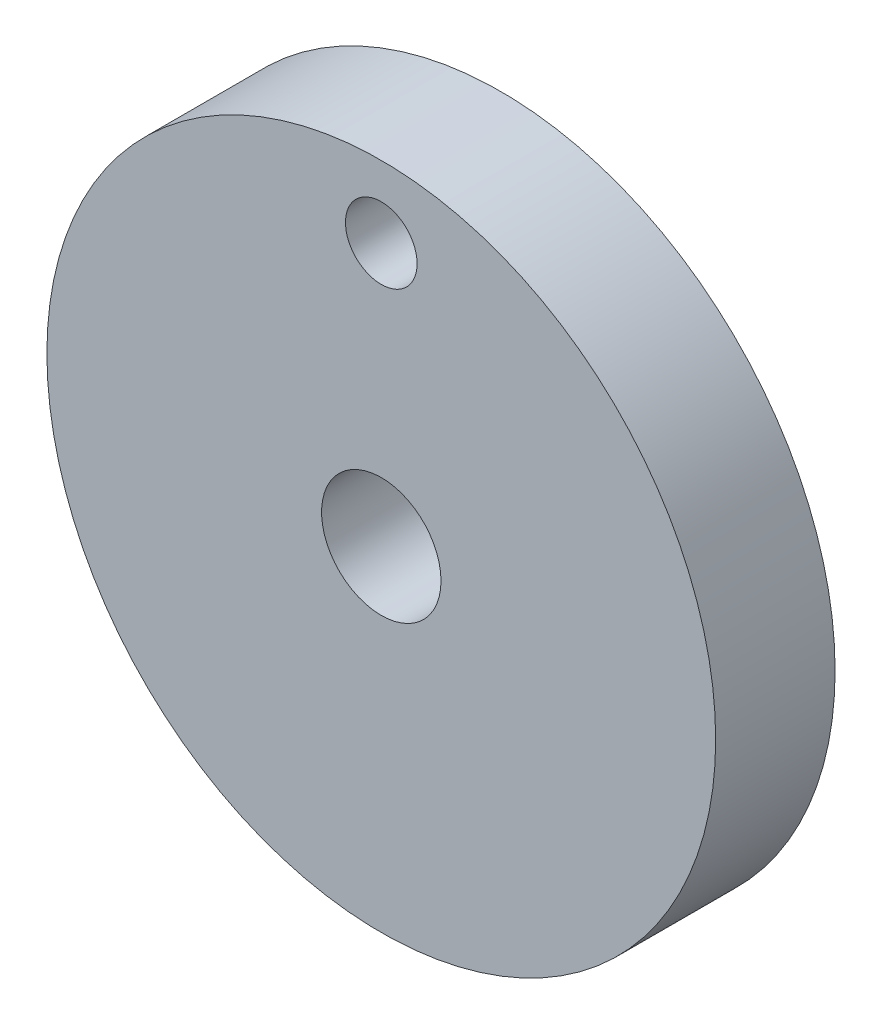
ISO-10303-21;
HEADER;
FILE_DESCRIPTION(('STEP AP214'),'2;1');
FILE_NAME('part.step','',(''),(''),'','','');
FILE_SCHEMA(('AUTOMOTIVE_DESIGN { 1 0 10303 214 1 1 1 1 }'));
ENDSEC;
DATA;
#1=APPLICATION_CONTEXT('core data for automotive mechanical design processes');
#2=APPLICATION_PROTOCOL_DEFINITION('international standard','automotive_design',2000,#1);
#3=PRODUCT_CONTEXT('',#1,'mechanical');
#4=PRODUCT('Part','Part','',(#3));
#5=PRODUCT_RELATED_PRODUCT_CATEGORY('part','',(#4));
#6=PRODUCT_DEFINITION_FORMATION('','',#4);
#7=PRODUCT_DEFINITION_CONTEXT('part definition',#1,'design');
#8=PRODUCT_DEFINITION('design','',#6,#7);
#9=PRODUCT_DEFINITION_SHAPE('','',#8);
#10=(LENGTH_UNIT() NAMED_UNIT(*) SI_UNIT(.MILLI.,.METRE.));
#11=(NAMED_UNIT(*) PLANE_ANGLE_UNIT() SI_UNIT($,.RADIAN.));
#12=(NAMED_UNIT(*) SI_UNIT($,.STERADIAN.) SOLID_ANGLE_UNIT());
#13=UNCERTAINTY_MEASURE_WITH_UNIT(LENGTH_MEASURE(1.E-05),#10,'distance_accuracy_value','');
#14=(GEOMETRIC_REPRESENTATION_CONTEXT(3) GLOBAL_UNCERTAINTY_ASSIGNED_CONTEXT((#13)) GLOBAL_UNIT_ASSIGNED_CONTEXT((#10,
#11,#12)) REPRESENTATION_CONTEXT('',''));
#15=CARTESIAN_POINT('',(0.,0.,0.));
#16=DIRECTION('',(0.,0.,1.));
#17=DIRECTION('',(1.,0.,0.));
#18=AXIS2_PLACEMENT_3D('',#15,#16,#17);
#19=CARTESIAN_POINT('',(0.,0.,5.));
#20=DIRECTION('',(0.,0.,-1.));
#21=DIRECTION('',(-1.,0.,0.));
#22=AXIS2_PLACEMENT_3D('',#19,#20,#21);
#23=CYLINDRICAL_SURFACE('',#22,14.);
#24=CARTESIAN_POINT('',(0.,0.,5.));
#25=DIRECTION('',(0.,0.,1.));
#26=DIRECTION('',(1.,0.,0.));
#27=AXIS2_PLACEMENT_3D('',#24,#25,#26);
#28=CIRCLE('',#27,14.);
#29=CARTESIAN_POINT('',(14.,0.,5.));
#30=VERTEX_POINT('',#29);
#31=EDGE_CURVE('E10',#30,#30,#28,.T.);
#32=ORIENTED_EDGE('',*,*,#31,.F.);
#33=EDGE_LOOP('',(#32));
#34=FACE_BOUND('',#33,.T.);
#35=CARTESIAN_POINT('',(0.,0.,0.));
#36=DIRECTION('',(0.,0.,1.));
#37=DIRECTION('',(1.,0.,0.));
#38=AXIS2_PLACEMENT_3D('',#35,#36,#37);
#39=CIRCLE('',#38,14.);
#40=CARTESIAN_POINT('',(14.,0.,0.));
#41=VERTEX_POINT('',#40);
#42=EDGE_CURVE('E46',#41,#41,#39,.T.);
#43=ORIENTED_EDGE('',*,*,#42,.T.);
#44=EDGE_LOOP('',(#43));
#45=FACE_BOUND('',#44,.T.);
#46=ADVANCED_FACE('F43',(#34,#45),#23,.T.);
#47=CARTESIAN_POINT('',(0.,0.,5.));
#48=DIRECTION('',(0.,0.,1.));
#49=DIRECTION('',(1.,0.,0.));
#50=AXIS2_PLACEMENT_3D('',#47,#48,#49);
#51=PLANE('',#50);
#52=CARTESIAN_POINT('',(0.,11.,5.));
#53=DIRECTION('',(0.,0.,1.));
#54=DIRECTION('',(1.,0.,0.));
#55=AXIS2_PLACEMENT_3D('',#52,#53,#54);
#56=CIRCLE('',#55,1.5);
#57=CARTESIAN_POINT('',(1.5,11.,5.));
#58=VERTEX_POINT('',#57);
#59=EDGE_CURVE('E55',#58,#58,#56,.T.);
#60=ORIENTED_EDGE('',*,*,#59,.F.);
#61=EDGE_LOOP('',(#60));
#62=FACE_BOUND('',#61,.T.);
#63=CARTESIAN_POINT('',(0.,0.,5.));
#64=DIRECTION('',(0.,0.,1.));
#65=DIRECTION('',(1.,0.,0.));
#66=AXIS2_PLACEMENT_3D('',#63,#64,#65);
#67=CIRCLE('',#66,2.5);
#68=CARTESIAN_POINT('',(2.5,0.,5.));
#69=VERTEX_POINT('',#68);
#70=EDGE_CURVE('E57',#69,#69,#67,.T.);
#71=ORIENTED_EDGE('',*,*,#70,.F.);
#72=EDGE_LOOP('',(#71));
#73=FACE_BOUND('',#72,.T.);
#74=ORIENTED_EDGE('',*,*,#31,.T.);
#75=EDGE_LOOP('',(#74));
#76=FACE_BOUND('',#75,.T.);
#77=ADVANCED_FACE('F76',(#62,#73,#76),#51,.T.);
#78=CARTESIAN_POINT('',(0.,0.,0.));
#79=DIRECTION('',(0.,0.,1.));
#80=DIRECTION('',(1.,0.,0.));
#81=AXIS2_PLACEMENT_3D('',#78,#79,#80);
#82=PLANE('',#81);
#83=CARTESIAN_POINT('',(0.,11.,0.));
#84=DIRECTION('',(0.,0.,1.));
#85=DIRECTION('',(1.,0.,0.));
#86=AXIS2_PLACEMENT_3D('',#83,#84,#85);
#87=CIRCLE('',#86,1.5);
#88=CARTESIAN_POINT('',(1.5,11.,0.));
#89=VERTEX_POINT('',#88);
#90=EDGE_CURVE('E65',#89,#89,#87,.T.);
#91=ORIENTED_EDGE('',*,*,#90,.T.);
#92=EDGE_LOOP('',(#91));
#93=FACE_BOUND('',#92,.T.);
#94=CARTESIAN_POINT('',(0.,0.,0.));
#95=DIRECTION('',(0.,0.,1.));
#96=DIRECTION('',(1.,0.,0.));
#97=AXIS2_PLACEMENT_3D('',#94,#95,#96);
#98=CIRCLE('',#97,2.5);
#99=CARTESIAN_POINT('',(2.5,0.,0.));
#100=VERTEX_POINT('',#99);
#101=EDGE_CURVE('E61',#100,#100,#98,.T.);
#102=ORIENTED_EDGE('',*,*,#101,.T.);
#103=EDGE_LOOP('',(#102));
#104=FACE_BOUND('',#103,.T.);
#105=ORIENTED_EDGE('',*,*,#42,.F.);
#106=EDGE_LOOP('',(#105));
#107=FACE_BOUND('',#106,.T.);
#108=ADVANCED_FACE('F79',(#93,#104,#107),#82,.F.);
#109=CARTESIAN_POINT('',(0.,0.,5.));
#110=DIRECTION('',(0.,0.,-1.));
#111=DIRECTION('',(-1.,0.,0.));
#112=AXIS2_PLACEMENT_3D('',#109,#110,#111);
#113=CYLINDRICAL_SURFACE('',#112,2.5);
#114=ORIENTED_EDGE('',*,*,#70,.T.);
#115=EDGE_LOOP('',(#114));
#116=FACE_BOUND('',#115,.T.);
#117=ORIENTED_EDGE('',*,*,#101,.F.);
#118=EDGE_LOOP('',(#117));
#119=FACE_BOUND('',#118,.T.);
#120=ADVANCED_FACE('F83',(#116,#119),#113,.F.);
#121=CARTESIAN_POINT('',(0.,11.,5.));
#122=DIRECTION('',(0.,0.,-1.));
#123=DIRECTION('',(-1.,0.,0.));
#124=AXIS2_PLACEMENT_3D('',#121,#122,#123);
#125=CYLINDRICAL_SURFACE('',#124,1.5);
#126=ORIENTED_EDGE('',*,*,#59,.T.);
#127=EDGE_LOOP('',(#126));
#128=FACE_BOUND('',#127,.T.);
#129=ORIENTED_EDGE('',*,*,#90,.F.);
#130=EDGE_LOOP('',(#129));
#131=FACE_BOUND('',#130,.T.);
#132=ADVANCED_FACE('F73',(#128,#131),#125,.F.);
#133=CLOSED_SHELL('',(#46,#77,#108,#120,#132));
#134=MANIFOLD_SOLID_BREP('B2',#133);
#135=ADVANCED_BREP_SHAPE_REPRESENTATION('',(#18,#134),#14);
#136=SHAPE_DEFINITION_REPRESENTATION(#9,#135);
ENDSEC;
END-ISO-10303-21;
